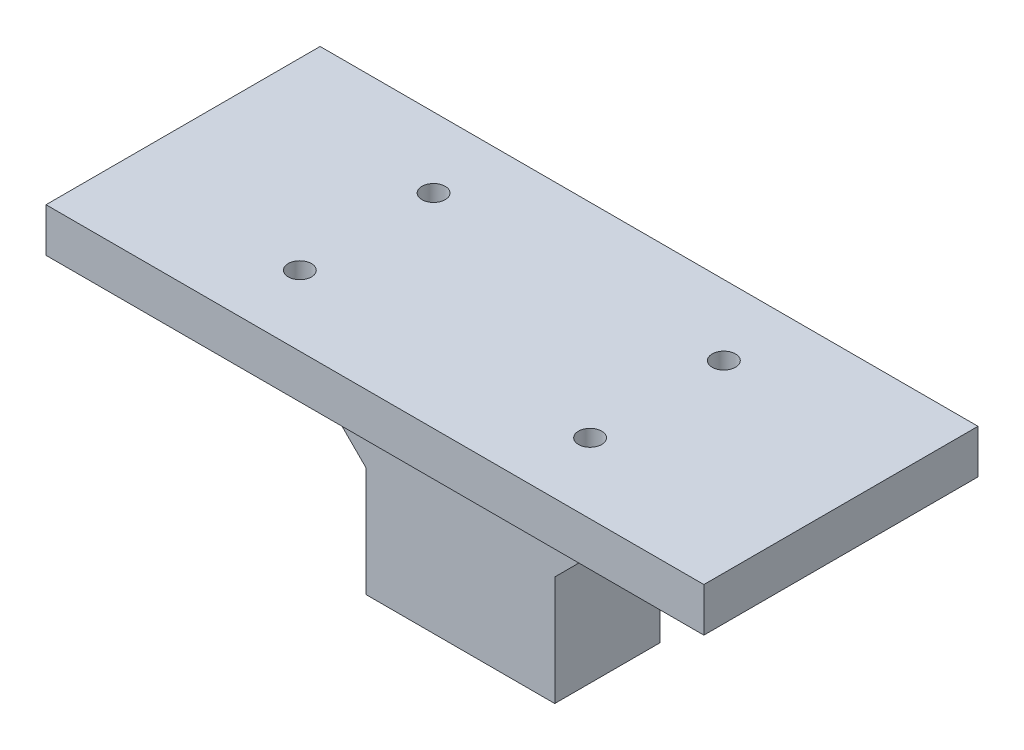
ISO-10303-21;
HEADER;
FILE_DESCRIPTION(('STEP AP214'),'2;1');
FILE_NAME('part.step','',(''),(''),'','','');
FILE_SCHEMA(('AUTOMOTIVE_DESIGN { 1 0 10303 214 1 1 1 1 }'));
ENDSEC;
DATA;
#1=APPLICATION_CONTEXT('core data for automotive mechanical design processes');
#2=APPLICATION_PROTOCOL_DEFINITION('international standard','automotive_design',2000,#1);
#3=PRODUCT_CONTEXT('',#1,'mechanical');
#4=PRODUCT('Part','Part','',(#3));
#5=PRODUCT_RELATED_PRODUCT_CATEGORY('part','',(#4));
#6=PRODUCT_DEFINITION_FORMATION('','',#4);
#7=PRODUCT_DEFINITION_CONTEXT('part definition',#1,'design');
#8=PRODUCT_DEFINITION('design','',#6,#7);
#9=PRODUCT_DEFINITION_SHAPE('','',#8);
#10=(LENGTH_UNIT() NAMED_UNIT(*) SI_UNIT(.MILLI.,.METRE.));
#11=(NAMED_UNIT(*) PLANE_ANGLE_UNIT() SI_UNIT($,.RADIAN.));
#12=(NAMED_UNIT(*) SI_UNIT($,.STERADIAN.) SOLID_ANGLE_UNIT());
#13=UNCERTAINTY_MEASURE_WITH_UNIT(LENGTH_MEASURE(1.E-05),#10,'distance_accuracy_value','');
#14=(GEOMETRIC_REPRESENTATION_CONTEXT(3) GLOBAL_UNCERTAINTY_ASSIGNED_CONTEXT((#13)) GLOBAL_UNIT_ASSIGNED_CONTEXT((#10,
#11,#12)) REPRESENTATION_CONTEXT('',''));
#15=CARTESIAN_POINT('',(0.,0.,0.));
#16=DIRECTION('',(0.,0.,1.));
#17=DIRECTION('',(1.,0.,0.));
#18=AXIS2_PLACEMENT_3D('',#15,#16,#17);
#19=CARTESIAN_POINT('',(125.642135623731,-10.,0.));
#20=DIRECTION('',(0.,0.,1.));
#21=DIRECTION('',(1.,0.,0.));
#22=AXIS2_PLACEMENT_3D('',#19,#20,#21);
#23=CYLINDRICAL_SURFACE('',#22,10.);
#24=CARTESIAN_POINT('',(125.642135623731,-10.,-41.5));
#25=DIRECTION('',(0.,0.,1.));
#26=DIRECTION('',(-1.,0.,0.));
#27=AXIS2_PLACEMENT_3D('',#24,#25,#26);
#28=CIRCLE('',#27,10.);
#29=CARTESIAN_POINT('',(125.642135623731,0.,-41.5));
#30=VERTEX_POINT('',#29);
#31=CARTESIAN_POINT('',(118.571067811865,-2.92893218813453,-41.5));
#32=VERTEX_POINT('',#31);
#33=EDGE_CURVE('E315',#30,#32,#28,.T.);
#34=ORIENTED_EDGE('',*,*,#33,.F.);
#35=DIRECTION('',(0.,0.,-1.));
#36=VECTOR('',#35,1.);
#37=CARTESIAN_POINT('',(125.642135623731,0.,-43.5));
#38=LINE('',#37,#36);
#39=CARTESIAN_POINT('',(125.642135623731,0.,-19.5));
#40=VERTEX_POINT('',#39);
#41=EDGE_CURVE('E248',#40,#30,#38,.T.);
#42=ORIENTED_EDGE('',*,*,#41,.F.);
#43=CARTESIAN_POINT('',(125.642135623731,-10.,-19.5));
#44=DIRECTION('',(0.,0.,-1.));
#45=DIRECTION('',(-1.,0.,0.));
#46=AXIS2_PLACEMENT_3D('',#43,#44,#45);
#47=CIRCLE('',#46,10.);
#48=CARTESIAN_POINT('',(118.571067811865,-2.9289321881345,-19.5));
#49=VERTEX_POINT('',#48);
#50=EDGE_CURVE('E259',#49,#40,#47,.T.);
#51=ORIENTED_EDGE('',*,*,#50,.F.);
#52=DIRECTION('',(0.,0.,-1.));
#53=VECTOR('',#52,1.);
#54=CARTESIAN_POINT('',(118.571067811865,-2.92893218813453,-19.5));
#55=LINE('',#54,#53);
#56=EDGE_CURVE('E250',#32,#49,#55,.F.);
#57=ORIENTED_EDGE('',*,*,#56,.F.);
#58=EDGE_LOOP('',(#34,#42,#51,#57));
#59=FACE_BOUND('',#58,.T.);
#60=ADVANCED_FACE('F46',(#59),#23,.F.);
#61=CARTESIAN_POINT('',(0.,10.,-62.5));
#62=DIRECTION('',(0.,0.,-1.));
#63=DIRECTION('',(-1.,0.,0.));
#64=AXIS2_PLACEMENT_3D('',#61,#62,#63);
#65=PLANE('',#64);
#66=DIRECTION('',(1.,0.,0.));
#67=VECTOR('',#66,1.);
#68=CARTESIAN_POINT('',(0.,0.,-62.5));
#69=LINE('',#68,#67);
#70=CARTESIAN_POINT('',(0.,0.,-62.5));
#71=VERTEX_POINT('',#70);
#72=CARTESIAN_POINT('',(52.5,0.,-62.5));
#73=VERTEX_POINT('',#72);
#74=EDGE_CURVE('E424',#71,#73,#69,.T.);
#75=ORIENTED_EDGE('',*,*,#74,.F.);
#76=DIRECTION('',(0.,-1.,0.));
#77=VECTOR('',#76,1.);
#78=CARTESIAN_POINT('',(0.,10.,-62.5));
#79=LINE('',#78,#77);
#80=CARTESIAN_POINT('',(0.,10.,-62.5));
#81=VERTEX_POINT('',#80);
#82=EDGE_CURVE('E441',#81,#71,#79,.T.);
#83=ORIENTED_EDGE('',*,*,#82,.F.);
#84=DIRECTION('',(1.,0.,0.));
#85=VECTOR('',#84,1.);
#86=CARTESIAN_POINT('',(0.,10.,-62.5));
#87=LINE('',#86,#85);
#88=CARTESIAN_POINT('',(150.,10.,-62.5));
#89=VERTEX_POINT('',#88);
#90=EDGE_CURVE('E400',#81,#89,#87,.T.);
#91=ORIENTED_EDGE('',*,*,#90,.T.);
#92=DIRECTION('',(0.,-1.,0.));
#93=VECTOR('',#92,1.);
#94=CARTESIAN_POINT('',(150.,10.,-62.5));
#95=LINE('',#94,#93);
#96=CARTESIAN_POINT('',(150.,0.,-62.5));
#97=VERTEX_POINT('',#96);
#98=EDGE_CURVE('E411',#89,#97,#95,.T.);
#99=ORIENTED_EDGE('',*,*,#98,.T.);
#100=CARTESIAN_POINT('',(97.5,0.,-62.5));
#101=VERTEX_POINT('',#100);
#102=EDGE_CURVE('E423',#101,#97,#69,.T.);
#103=ORIENTED_EDGE('',*,*,#102,.F.);
#104=DIRECTION('',(-1.,0.,0.));
#105=VECTOR('',#104,1.);
#106=CARTESIAN_POINT('',(96.5,0.,-62.5));
#107=LINE('',#106,#105);
#108=EDGE_CURVE('E76',#101,#73,#107,.T.);
#109=ORIENTED_EDGE('',*,*,#108,.T.);
#110=EDGE_LOOP('',(#75,#83,#91,#99,#103,#109));
#111=FACE_BOUND('',#110,.T.);
#112=ADVANCED_FACE('F493',(#111),#65,.T.);
#113=CARTESIAN_POINT('',(0.,10.,0.));
#114=DIRECTION('',(-1.,0.,0.));
#115=DIRECTION('',(0.,0.,1.));
#116=AXIS2_PLACEMENT_3D('',#113,#114,#115);
#117=PLANE('',#116);
#118=DIRECTION('',(0.,0.,-1.));
#119=VECTOR('',#118,1.);
#120=CARTESIAN_POINT('',(0.,0.,0.));
#121=LINE('',#120,#119);
#122=CARTESIAN_POINT('',(0.,0.,0.));
#123=VERTEX_POINT('',#122);
#124=EDGE_CURVE('E426',#123,#71,#121,.T.);
#125=ORIENTED_EDGE('',*,*,#124,.F.);
#126=DIRECTION('',(0.,-1.,0.));
#127=VECTOR('',#126,1.);
#128=CARTESIAN_POINT('',(0.,10.,0.));
#129=LINE('',#128,#127);
#130=CARTESIAN_POINT('',(0.,10.,0.));
#131=VERTEX_POINT('',#130);
#132=EDGE_CURVE('E439',#131,#123,#129,.T.);
#133=ORIENTED_EDGE('',*,*,#132,.F.);
#134=DIRECTION('',(0.,0.,-1.));
#135=VECTOR('',#134,1.);
#136=CARTESIAN_POINT('',(0.,10.,0.));
#137=LINE('',#136,#135);
#138=EDGE_CURVE('E403',#131,#81,#137,.T.);
#139=ORIENTED_EDGE('',*,*,#138,.T.);
#140=ORIENTED_EDGE('',*,*,#82,.T.);
#141=EDGE_LOOP('',(#125,#133,#139,#140));
#142=FACE_BOUND('',#141,.T.);
#143=ADVANCED_FACE('F503',(#142),#117,.T.);
#144=CARTESIAN_POINT('',(0.,10.,0.));
#145=DIRECTION('',(0.,0.,-1.));
#146=DIRECTION('',(-1.,0.,0.));
#147=AXIS2_PLACEMENT_3D('',#144,#145,#146);
#148=PLANE('',#147);
#149=DIRECTION('',(1.,0.,0.));
#150=VECTOR('',#149,1.);
#151=CARTESIAN_POINT('',(0.,0.,0.));
#152=LINE('',#151,#150);
#153=CARTESIAN_POINT('',(150.,0.,0.));
#154=VERTEX_POINT('',#153);
#155=EDGE_CURVE('E429',#123,#154,#152,.T.);
#156=ORIENTED_EDGE('',*,*,#155,.T.);
#157=DIRECTION('',(0.,-1.,0.));
#158=VECTOR('',#157,1.);
#159=CARTESIAN_POINT('',(150.,10.,0.));
#160=LINE('',#159,#158);
#161=CARTESIAN_POINT('',(150.,10.,0.));
#162=VERTEX_POINT('',#161);
#163=EDGE_CURVE('E436',#162,#154,#160,.T.);
#164=ORIENTED_EDGE('',*,*,#163,.F.);
#165=DIRECTION('',(1.,0.,0.));
#166=VECTOR('',#165,1.);
#167=CARTESIAN_POINT('',(0.,10.,0.));
#168=LINE('',#167,#166);
#169=EDGE_CURVE('E406',#131,#162,#168,.T.);
#170=ORIENTED_EDGE('',*,*,#169,.F.);
#171=ORIENTED_EDGE('',*,*,#132,.T.);
#172=EDGE_LOOP('',(#156,#164,#170,#171));
#173=FACE_BOUND('',#172,.T.);
#174=ADVANCED_FACE('F553',(#173),#148,.F.);
#175=CARTESIAN_POINT('',(108.05464,10.,-46.5));
#176=DIRECTION('',(0.,-1.,0.));
#177=DIRECTION('',(0.,0.,-1.));
#178=AXIS2_PLACEMENT_3D('',#175,#176,#177);
#179=CYLINDRICAL_SURFACE('',#178,2.65);
#180=CARTESIAN_POINT('',(108.05464,10.,-46.5));
#181=DIRECTION('',(0.,1.,0.));
#182=DIRECTION('',(0.,0.,1.));
#183=AXIS2_PLACEMENT_3D('',#180,#181,#182);
#184=CIRCLE('',#183,2.65);
#185=CARTESIAN_POINT('',(108.05464,10.,-43.85));
#186=VERTEX_POINT('',#185);
#187=EDGE_CURVE('E397',#186,#186,#184,.T.);
#188=ORIENTED_EDGE('',*,*,#187,.T.);
#189=EDGE_LOOP('',(#188));
#190=FACE_BOUND('',#189,.T.);
#191=CARTESIAN_POINT('',(108.05464,0.,-46.5));
#192=DIRECTION('',(0.,1.,0.));
#193=DIRECTION('',(0.,0.,1.));
#194=AXIS2_PLACEMENT_3D('',#191,#192,#193);
#195=CIRCLE('',#194,2.65);
#196=CARTESIAN_POINT('',(108.05464,0.,-43.85));
#197=VERTEX_POINT('',#196);
#198=EDGE_CURVE('E420',#197,#197,#195,.T.);
#199=ORIENTED_EDGE('',*,*,#198,.F.);
#200=EDGE_LOOP('',(#199));
#201=FACE_BOUND('',#200,.T.);
#202=ADVANCED_FACE('F550',(#190,#201),#179,.F.);
#203=CARTESIAN_POINT('',(41.87366,10.,-46.5));
#204=DIRECTION('',(0.,-1.,0.));
#205=DIRECTION('',(0.,0.,-1.));
#206=AXIS2_PLACEMENT_3D('',#203,#204,#205);
#207=CYLINDRICAL_SURFACE('',#206,2.65);
#208=CARTESIAN_POINT('',(41.87366,10.,-46.5));
#209=DIRECTION('',(0.,1.,0.));
#210=DIRECTION('',(0.,0.,1.));
#211=AXIS2_PLACEMENT_3D('',#208,#209,#210);
#212=CIRCLE('',#211,2.65);
#213=CARTESIAN_POINT('',(41.87366,10.,-43.85));
#214=VERTEX_POINT('',#213);
#215=EDGE_CURVE('E394',#214,#214,#212,.T.);
#216=ORIENTED_EDGE('',*,*,#215,.T.);
#217=EDGE_LOOP('',(#216));
#218=FACE_BOUND('',#217,.T.);
#219=CARTESIAN_POINT('',(41.87366,0.,-46.5));
#220=DIRECTION('',(0.,1.,0.));
#221=DIRECTION('',(0.,0.,1.));
#222=AXIS2_PLACEMENT_3D('',#219,#220,#221);
#223=CIRCLE('',#222,2.65);
#224=CARTESIAN_POINT('',(41.87366,0.,-43.85));
#225=VERTEX_POINT('',#224);
#226=EDGE_CURVE('E417',#225,#225,#223,.T.);
#227=ORIENTED_EDGE('',*,*,#226,.F.);
#228=EDGE_LOOP('',(#227));
#229=FACE_BOUND('',#228,.T.);
#230=ADVANCED_FACE('F546',(#218,#229),#207,.F.);
#231=CARTESIAN_POINT('',(41.87366,10.,-16.));
#232=DIRECTION('',(0.,-1.,0.));
#233=DIRECTION('',(0.,0.,-1.));
#234=AXIS2_PLACEMENT_3D('',#231,#232,#233);
#235=CYLINDRICAL_SURFACE('',#234,2.65);
#236=CARTESIAN_POINT('',(41.87366,10.,-16.));
#237=DIRECTION('',(0.,1.,0.));
#238=DIRECTION('',(0.,0.,1.));
#239=AXIS2_PLACEMENT_3D('',#236,#237,#238);
#240=CIRCLE('',#239,2.65);
#241=CARTESIAN_POINT('',(41.87366,10.,-13.35));
#242=VERTEX_POINT('',#241);
#243=EDGE_CURVE('E390',#242,#242,#240,.T.);
#244=ORIENTED_EDGE('',*,*,#243,.T.);
#245=EDGE_LOOP('',(#244));
#246=FACE_BOUND('',#245,.T.);
#247=CARTESIAN_POINT('',(41.87366,0.,-16.));
#248=DIRECTION('',(0.,1.,0.));
#249=DIRECTION('',(0.,0.,1.));
#250=AXIS2_PLACEMENT_3D('',#247,#248,#249);
#251=CIRCLE('',#250,2.65);
#252=CARTESIAN_POINT('',(41.87366,0.,-13.35));
#253=VERTEX_POINT('',#252);
#254=EDGE_CURVE('E414',#253,#253,#251,.T.);
#255=ORIENTED_EDGE('',*,*,#254,.F.);
#256=EDGE_LOOP('',(#255));
#257=FACE_BOUND('',#256,.T.);
#258=ADVANCED_FACE('F542',(#246,#257),#235,.F.);
#259=CARTESIAN_POINT('',(108.05464,10.,-16.));
#260=DIRECTION('',(0.,-1.,0.));
#261=DIRECTION('',(0.,0.,-1.));
#262=AXIS2_PLACEMENT_3D('',#259,#260,#261);
#263=CYLINDRICAL_SURFACE('',#262,2.65);
#264=CARTESIAN_POINT('',(108.05464,10.,-16.));
#265=DIRECTION('',(0.,1.,0.));
#266=DIRECTION('',(0.,0.,1.));
#267=AXIS2_PLACEMENT_3D('',#264,#265,#266);
#268=CIRCLE('',#267,2.65);
#269=CARTESIAN_POINT('',(108.05464,10.,-13.35));
#270=VERTEX_POINT('',#269);
#271=EDGE_CURVE('E387',#270,#270,#268,.T.);
#272=ORIENTED_EDGE('',*,*,#271,.T.);
#273=EDGE_LOOP('',(#272));
#274=FACE_BOUND('',#273,.T.);
#275=CARTESIAN_POINT('',(108.05464,0.,-16.));
#276=DIRECTION('',(0.,1.,0.));
#277=DIRECTION('',(0.,0.,1.));
#278=AXIS2_PLACEMENT_3D('',#275,#276,#277);
#279=CIRCLE('',#278,2.65);
#280=CARTESIAN_POINT('',(108.05464,0.,-13.35));
#281=VERTEX_POINT('',#280);
#282=EDGE_CURVE('E386',#281,#281,#279,.T.);
#283=ORIENTED_EDGE('',*,*,#282,.F.);
#284=EDGE_LOOP('',(#283));
#285=FACE_BOUND('',#284,.T.);
#286=ADVANCED_FACE('F539',(#274,#285),#263,.F.);
#287=CARTESIAN_POINT('',(150.,10.,0.));
#288=DIRECTION('',(-1.,0.,0.));
#289=DIRECTION('',(0.,0.,1.));
#290=AXIS2_PLACEMENT_3D('',#287,#288,#289);
#291=PLANE('',#290);
#292=DIRECTION('',(0.,0.,-1.));
#293=VECTOR('',#292,1.);
#294=CARTESIAN_POINT('',(150.,0.,0.));
#295=LINE('',#294,#293);
#296=EDGE_CURVE('E391',#154,#97,#295,.T.);
#297=ORIENTED_EDGE('',*,*,#296,.T.);
#298=ORIENTED_EDGE('',*,*,#98,.F.);
#299=DIRECTION('',(0.,0.,-1.));
#300=VECTOR('',#299,1.);
#301=CARTESIAN_POINT('',(150.,10.,0.));
#302=LINE('',#301,#300);
#303=EDGE_CURVE('E409',#162,#89,#302,.T.);
#304=ORIENTED_EDGE('',*,*,#303,.F.);
#305=ORIENTED_EDGE('',*,*,#163,.T.);
#306=EDGE_LOOP('',(#297,#298,#304,#305));
#307=FACE_BOUND('',#306,.T.);
#308=ADVANCED_FACE('F497',(#307),#291,.F.);
#309=CARTESIAN_POINT('',(0.,10.,0.));
#310=DIRECTION('',(0.,1.,0.));
#311=DIRECTION('',(0.,0.,1.));
#312=AXIS2_PLACEMENT_3D('',#309,#310,#311);
#313=PLANE('',#312);
#314=ORIENTED_EDGE('',*,*,#271,.F.);
#315=EDGE_LOOP('',(#314));
#316=FACE_BOUND('',#315,.T.);
#317=ORIENTED_EDGE('',*,*,#243,.F.);
#318=EDGE_LOOP('',(#317));
#319=FACE_BOUND('',#318,.T.);
#320=ORIENTED_EDGE('',*,*,#215,.F.);
#321=EDGE_LOOP('',(#320));
#322=FACE_BOUND('',#321,.T.);
#323=ORIENTED_EDGE('',*,*,#187,.F.);
#324=EDGE_LOOP('',(#323));
#325=FACE_BOUND('',#324,.T.);
#326=ORIENTED_EDGE('',*,*,#90,.F.);
#327=ORIENTED_EDGE('',*,*,#138,.F.);
#328=ORIENTED_EDGE('',*,*,#169,.T.);
#329=ORIENTED_EDGE('',*,*,#303,.T.);
#330=EDGE_LOOP('',(#326,#327,#328,#329));
#331=FACE_BOUND('',#330,.T.);
#332=ADVANCED_FACE('F562',(#316,#319,#322,#325,#331),#313,.T.);
#333=CARTESIAN_POINT('',(0.,0.,0.));
#334=DIRECTION('',(0.,1.,0.));
#335=DIRECTION('',(0.,0.,1.));
#336=AXIS2_PLACEMENT_3D('',#333,#334,#335);
#337=PLANE('',#336);
#338=DIRECTION('',(0.,0.,-1.));
#339=VECTOR('',#338,1.);
#340=CARTESIAN_POINT('',(97.5,0.,-41.5));
#341=LINE('',#340,#339);
#342=CARTESIAN_POINT('',(97.5,0.,-41.5));
#343=VERTEX_POINT('',#342);
#344=CARTESIAN_POINT('',(97.5,0.,-43.5));
#345=VERTEX_POINT('',#344);
#346=EDGE_CURVE('E316',#343,#345,#341,.T.);
#347=ORIENTED_EDGE('',*,*,#346,.T.);
#348=DIRECTION('',(0.,0.,-1.));
#349=VECTOR('',#348,1.);
#350=CARTESIAN_POINT('',(97.5,0.,0.));
#351=LINE('',#350,#349);
#352=EDGE_CURVE('E267',#345,#101,#351,.T.);
#353=ORIENTED_EDGE('',*,*,#352,.T.);
#354=ORIENTED_EDGE('',*,*,#102,.T.);
#355=ORIENTED_EDGE('',*,*,#296,.F.);
#356=ORIENTED_EDGE('',*,*,#155,.F.);
#357=ORIENTED_EDGE('',*,*,#124,.T.);
#358=ORIENTED_EDGE('',*,*,#74,.T.);
#359=DIRECTION('',(0.,0.,-1.));
#360=VECTOR('',#359,1.);
#361=CARTESIAN_POINT('',(52.5,0.,-43.5));
#362=LINE('',#361,#360);
#363=CARTESIAN_POINT('',(52.5,0.,-43.5));
#364=VERTEX_POINT('',#363);
#365=EDGE_CURVE('E270',#73,#364,#362,.F.);
#366=ORIENTED_EDGE('',*,*,#365,.T.);
#367=DIRECTION('',(0.,0.,-1.));
#368=VECTOR('',#367,1.);
#369=CARTESIAN_POINT('',(52.5,0.,-41.5));
#370=LINE('',#369,#368);
#371=CARTESIAN_POINT('',(52.5,0.,-41.5));
#372=VERTEX_POINT('',#371);
#373=EDGE_CURVE('E228',#372,#364,#370,.T.);
#374=ORIENTED_EDGE('',*,*,#373,.F.);
#375=DIRECTION('',(1.,0.,0.));
#376=VECTOR('',#375,1.);
#377=CARTESIAN_POINT('',(24.3578643762692,0.,-41.5));
#378=LINE('',#377,#376);
#379=CARTESIAN_POINT('',(24.3578643762692,0.,-41.5));
#380=VERTEX_POINT('',#379);
#381=EDGE_CURVE('E220',#380,#372,#378,.T.);
#382=ORIENTED_EDGE('',*,*,#381,.F.);
#383=DIRECTION('',(0.,0.,-1.));
#384=VECTOR('',#383,1.);
#385=CARTESIAN_POINT('',(24.3578643762691,0.,-19.5));
#386=LINE('',#385,#384);
#387=CARTESIAN_POINT('',(24.3578643762691,0.,-19.5));
#388=VERTEX_POINT('',#387);
#389=EDGE_CURVE('E225',#380,#388,#386,.F.);
#390=ORIENTED_EDGE('',*,*,#389,.T.);
#391=DIRECTION('',(-1.,0.,0.));
#392=VECTOR('',#391,1.);
#393=CARTESIAN_POINT('',(0.,0.,-19.5));
#394=LINE('',#393,#392);
#395=EDGE_CURVE('E356',#40,#388,#394,.T.);
#396=ORIENTED_EDGE('',*,*,#395,.F.);
#397=ORIENTED_EDGE('',*,*,#41,.T.);
#398=DIRECTION('',(1.,0.,0.));
#399=VECTOR('',#398,1.);
#400=CARTESIAN_POINT('',(97.5,0.,-41.5));
#401=LINE('',#400,#399);
#402=EDGE_CURVE('E319',#343,#30,#401,.T.);
#403=ORIENTED_EDGE('',*,*,#402,.F.);
#404=EDGE_LOOP('',(#347,#353,#354,#355,#356,#357,#358,#366,#374,#382,#390,#396,#397,#403));
#405=FACE_BOUND('',#404,.T.);
#406=ORIENTED_EDGE('',*,*,#282,.T.);
#407=EDGE_LOOP('',(#406));
#408=FACE_BOUND('',#407,.T.);
#409=ORIENTED_EDGE('',*,*,#254,.T.);
#410=EDGE_LOOP('',(#409));
#411=FACE_BOUND('',#410,.T.);
#412=ORIENTED_EDGE('',*,*,#226,.T.);
#413=EDGE_LOOP('',(#412));
#414=FACE_BOUND('',#413,.T.);
#415=ORIENTED_EDGE('',*,*,#198,.T.);
#416=EDGE_LOOP('',(#415));
#417=FACE_BOUND('',#416,.T.);
#418=ADVANCED_FACE('F222',(#405,#408,#411,#414,#417),#337,.F.);
#419=CARTESIAN_POINT('',(96.5,-50.,0.));
#420=DIRECTION('',(1.,0.,0.));
#421=DIRECTION('',(0.,0.,-1.));
#422=AXIS2_PLACEMENT_3D('',#419,#420,#421);
#423=PLANE('',#422);
#424=DIRECTION('',(0.,1.,0.));
#425=VECTOR('',#424,1.);
#426=CARTESIAN_POINT('',(96.5,-50.,-43.5));
#427=LINE('',#426,#425);
#428=CARTESIAN_POINT('',(96.5,-50.,-43.5));
#429=VERTEX_POINT('',#428);
#430=CARTESIAN_POINT('',(96.5,-25.,-43.5));
#431=VERTEX_POINT('',#430);
#432=EDGE_CURVE('E373',#429,#431,#427,.T.);
#433=ORIENTED_EDGE('',*,*,#432,.T.);
#434=DIRECTION('',(0.,0.,1.));
#435=VECTOR('',#434,1.);
#436=CARTESIAN_POINT('',(96.5,-24.9999999999999,0.));
#437=LINE('',#436,#435);
#438=CARTESIAN_POINT('',(96.5,-24.9999999999999,-19.5));
#439=VERTEX_POINT('',#438);
#440=EDGE_CURVE('E443',#431,#439,#437,.T.);
#441=ORIENTED_EDGE('',*,*,#440,.T.);
#442=DIRECTION('',(0.,1.,0.));
#443=VECTOR('',#442,1.);
#444=CARTESIAN_POINT('',(96.5,-50.,-19.5));
#445=LINE('',#444,#443);
#446=CARTESIAN_POINT('',(96.5,-50.,-19.5));
#447=VERTEX_POINT('',#446);
#448=EDGE_CURVE('E383',#447,#439,#445,.T.);
#449=ORIENTED_EDGE('',*,*,#448,.F.);
#450=DIRECTION('',(0.,0.,-1.));
#451=VECTOR('',#450,1.);
#452=CARTESIAN_POINT('',(96.5,-50.,0.));
#453=LINE('',#452,#451);
#454=EDGE_CURVE('E363',#447,#429,#453,.T.);
#455=ORIENTED_EDGE('',*,*,#454,.T.);
#456=EDGE_LOOP('',(#433,#441,#449,#455));
#457=FACE_BOUND('',#456,.T.);
#458=ADVANCED_FACE('F470',(#457),#423,.T.);
#459=CARTESIAN_POINT('',(0.,-50.,-19.5));
#460=DIRECTION('',(0.,0.,-1.));
#461=DIRECTION('',(-1.,0.,0.));
#462=AXIS2_PLACEMENT_3D('',#459,#460,#461);
#463=PLANE('',#462);
#464=ORIENTED_EDGE('',*,*,#395,.T.);
#465=CARTESIAN_POINT('',(24.3578643762691,-10.,-19.5));
#466=DIRECTION('',(0.,0.,-1.));
#467=DIRECTION('',(-1.,0.,0.));
#468=AXIS2_PLACEMENT_3D('',#465,#466,#467);
#469=CIRCLE('',#468,10.);
#470=CARTESIAN_POINT('',(31.4289321881346,-2.92893218813452,-19.5));
#471=VERTEX_POINT('',#470);
#472=EDGE_CURVE('E246',#388,#471,#469,.T.);
#473=ORIENTED_EDGE('',*,*,#472,.T.);
#474=DIRECTION('',(-0.707106781186548,0.707106781186547,0.));
#475=VECTOR('',#474,1.);
#476=CARTESIAN_POINT('',(39.25,-10.7499999999999,-19.5));
#477=LINE('',#476,#475);
#478=CARTESIAN_POINT('',(53.5,-24.9999999999999,-19.5));
#479=VERTEX_POINT('',#478);
#480=EDGE_CURVE('E253',#471,#479,#477,.F.);
#481=ORIENTED_EDGE('',*,*,#480,.T.);
#482=DIRECTION('',(0.,1.,0.));
#483=VECTOR('',#482,1.);
#484=CARTESIAN_POINT('',(53.5,-50.,-19.5));
#485=LINE('',#484,#483);
#486=CARTESIAN_POINT('',(53.5,-50.,-19.5));
#487=VERTEX_POINT('',#486);
#488=EDGE_CURVE('E380',#487,#479,#485,.T.);
#489=ORIENTED_EDGE('',*,*,#488,.F.);
#490=DIRECTION('',(-1.,0.,0.));
#491=VECTOR('',#490,1.);
#492=CARTESIAN_POINT('',(0.,-50.,-19.5));
#493=LINE('',#492,#491);
#494=EDGE_CURVE('E366',#447,#487,#493,.T.);
#495=ORIENTED_EDGE('',*,*,#494,.F.);
#496=ORIENTED_EDGE('',*,*,#448,.T.);
#497=DIRECTION('',(0.707106781186548,0.707106781186548,0.));
#498=VECTOR('',#497,1.);
#499=CARTESIAN_POINT('',(35.75,-85.75,-19.5));
#500=LINE('',#499,#498);
#501=EDGE_CURVE('E448',#439,#49,#500,.T.);
#502=ORIENTED_EDGE('',*,*,#501,.T.);
#503=ORIENTED_EDGE('',*,*,#50,.T.);
#504=EDGE_LOOP('',(#464,#473,#481,#489,#495,#496,#502,#503));
#505=FACE_BOUND('',#504,.T.);
#506=ADVANCED_FACE('F453',(#505),#463,.F.);
#507=CARTESIAN_POINT('',(53.5,-50.,0.));
#508=DIRECTION('',(1.,0.,0.));
#509=DIRECTION('',(0.,0.,-1.));
#510=AXIS2_PLACEMENT_3D('',#507,#508,#509);
#511=PLANE('',#510);
#512=ORIENTED_EDGE('',*,*,#488,.T.);
#513=DIRECTION('',(0.,0.,-1.));
#514=VECTOR('',#513,1.);
#515=CARTESIAN_POINT('',(53.5,-24.9999999999999,-43.5));
#516=LINE('',#515,#514);
#517=CARTESIAN_POINT('',(53.5,-24.9999999999999,-43.5));
#518=VERTEX_POINT('',#517);
#519=EDGE_CURVE('E445',#479,#518,#516,.T.);
#520=ORIENTED_EDGE('',*,*,#519,.T.);
#521=DIRECTION('',(0.,1.,0.));
#522=VECTOR('',#521,1.);
#523=CARTESIAN_POINT('',(53.5,-50.,-43.5));
#524=LINE('',#523,#522);
#525=CARTESIAN_POINT('',(53.5,-50.,-43.5));
#526=VERTEX_POINT('',#525);
#527=EDGE_CURVE('E377',#526,#518,#524,.T.);
#528=ORIENTED_EDGE('',*,*,#527,.F.);
#529=DIRECTION('',(0.,0.,-1.));
#530=VECTOR('',#529,1.);
#531=CARTESIAN_POINT('',(53.5,-50.,0.));
#532=LINE('',#531,#530);
#533=EDGE_CURVE('E368',#487,#526,#532,.T.);
#534=ORIENTED_EDGE('',*,*,#533,.F.);
#535=EDGE_LOOP('',(#512,#520,#528,#534));
#536=FACE_BOUND('',#535,.T.);
#537=ADVANCED_FACE('F458',(#536),#511,.F.);
#538=CARTESIAN_POINT('',(0.,-50.,-43.5));
#539=DIRECTION('',(0.,0.,-1.));
#540=DIRECTION('',(-1.,0.,0.));
#541=AXIS2_PLACEMENT_3D('',#538,#539,#540);
#542=PLANE('',#541);
#543=DIRECTION('',(-1.,0.,0.));
#544=VECTOR('',#543,1.);
#545=CARTESIAN_POINT('',(96.5,-25.,-43.5));
#546=LINE('',#545,#544);
#547=EDGE_CURVE('E328',#431,#518,#546,.T.);
#548=ORIENTED_EDGE('',*,*,#547,.F.);
#549=ORIENTED_EDGE('',*,*,#432,.F.);
#550=DIRECTION('',(-1.,0.,0.));
#551=VECTOR('',#550,1.);
#552=CARTESIAN_POINT('',(0.,-50.,-43.5));
#553=LINE('',#552,#551);
#554=EDGE_CURVE('E370',#429,#526,#553,.T.);
#555=ORIENTED_EDGE('',*,*,#554,.T.);
#556=ORIENTED_EDGE('',*,*,#527,.T.);
#557=EDGE_LOOP('',(#548,#549,#555,#556));
#558=FACE_BOUND('',#557,.T.);
#559=ADVANCED_FACE('F467',(#558),#542,.T.);
#560=CARTESIAN_POINT('',(0.,-50.,0.));
#561=DIRECTION('',(0.,-1.,0.));
#562=DIRECTION('',(0.,0.,-1.));
#563=AXIS2_PLACEMENT_3D('',#560,#561,#562);
#564=PLANE('',#563);
#565=DIRECTION('',(1.,0.,0.));
#566=VECTOR('',#565,1.);
#567=CARTESIAN_POINT('',(54.95366,-50.,-42.));
#568=LINE('',#567,#566);
#569=CARTESIAN_POINT('',(54.95366,-50.,-42.));
#570=VERTEX_POINT('',#569);
#571=CARTESIAN_POINT('',(95.05366,-50.,-42.));
#572=VERTEX_POINT('',#571);
#573=EDGE_CURVE('E331',#570,#572,#568,.T.);
#574=ORIENTED_EDGE('',*,*,#573,.F.);
#575=DIRECTION('',(0.,0.,-1.));
#576=VECTOR('',#575,1.);
#577=CARTESIAN_POINT('',(54.95366,-50.,-21.));
#578=LINE('',#577,#576);
#579=CARTESIAN_POINT('',(54.95366,-50.,-21.));
#580=VERTEX_POINT('',#579);
#581=EDGE_CURVE('E337',#580,#570,#578,.T.);
#582=ORIENTED_EDGE('',*,*,#581,.F.);
#583=DIRECTION('',(1.,0.,0.));
#584=VECTOR('',#583,1.);
#585=CARTESIAN_POINT('',(54.95366,-50.,-21.));
#586=LINE('',#585,#584);
#587=CARTESIAN_POINT('',(95.05366,-50.,-21.));
#588=VERTEX_POINT('',#587);
#589=EDGE_CURVE('E349',#580,#588,#586,.T.);
#590=ORIENTED_EDGE('',*,*,#589,.T.);
#591=DIRECTION('',(0.,0.,-1.));
#592=VECTOR('',#591,1.);
#593=CARTESIAN_POINT('',(95.05366,-50.,-21.));
#594=LINE('',#593,#592);
#595=EDGE_CURVE('E346',#588,#572,#594,.T.);
#596=ORIENTED_EDGE('',*,*,#595,.T.);
#597=EDGE_LOOP('',(#574,#582,#590,#596));
#598=FACE_BOUND('',#597,.T.);
#599=ORIENTED_EDGE('',*,*,#454,.F.);
#600=ORIENTED_EDGE('',*,*,#494,.T.);
#601=ORIENTED_EDGE('',*,*,#533,.T.);
#602=ORIENTED_EDGE('',*,*,#554,.F.);
#603=EDGE_LOOP('',(#599,#600,#601,#602));
#604=FACE_BOUND('',#603,.T.);
#605=ADVANCED_FACE('F538',(#598,#604),#564,.T.);
#606=CARTESIAN_POINT('',(121.5,0.,0.));
#607=DIRECTION('',(-0.707106781186548,0.707106781186548,0.));
#608=DIRECTION('',(0.,0.,-1.));
#609=AXIS2_PLACEMENT_3D('',#606,#607,#608);
#610=PLANE('',#609);
#611=CARTESIAN_POINT('',(97.5,-23.9999999999999,-44.5));
#612=DIRECTION('',(-0.707106781186548,0.707106781186548,0.));
#613=DIRECTION('',(-0.707106781186548,-0.707106781186548,0.));
#614=AXIS2_PLACEMENT_3D('',#611,#612,#613);
#615=ELLIPSE('',#614,1.41421356237309,1.);
#616=CARTESIAN_POINT('',(96.8341260138224,-24.6658739861776,-43.7539357705051));
#617=VERTEX_POINT('',#616);
#618=CARTESIAN_POINT('',(97.5,-23.9999999999999,-43.5));
#619=VERTEX_POINT('',#618);
#620=EDGE_CURVE('E287',#617,#619,#615,.T.);
#621=ORIENTED_EDGE('',*,*,#620,.T.);
#622=DIRECTION('',(0.,0.,-1.));
#623=VECTOR('',#622,1.);
#624=CARTESIAN_POINT('',(97.5,-23.9999999999999,-41.5));
#625=LINE('',#624,#623);
#626=CARTESIAN_POINT('',(97.5,-23.9999999999999,-41.5));
#627=VERTEX_POINT('',#626);
#628=EDGE_CURVE('E84',#627,#619,#625,.T.);
#629=ORIENTED_EDGE('',*,*,#628,.F.);
#630=DIRECTION('',(-0.707106781186548,-0.707106781186548,0.));
#631=VECTOR('',#630,1.);
#632=CARTESIAN_POINT('',(97.5,-23.9999999999999,-41.5));
#633=LINE('',#632,#631);
#634=EDGE_CURVE('E242',#32,#627,#633,.T.);
#635=ORIENTED_EDGE('',*,*,#634,.F.);
#636=ORIENTED_EDGE('',*,*,#56,.T.);
#637=ORIENTED_EDGE('',*,*,#501,.F.);
#638=ORIENTED_EDGE('',*,*,#440,.F.);
#639=DIRECTION('',(0.62286257729328,0.62286257729328,-0.473375558742892));
#640=VECTOR('',#639,1.);
#641=CARTESIAN_POINT('',(96.4999999999999,-25.,-43.5));
#642=LINE('',#641,#640);
#643=EDGE_CURVE('E56',#431,#617,#642,.T.);
#644=ORIENTED_EDGE('',*,*,#643,.T.);
#645=EDGE_LOOP('',(#621,#629,#635,#636,#637,#638,#644));
#646=FACE_BOUND('',#645,.T.);
#647=ADVANCED_FACE('F475',(#646),#610,.F.);
#648=CARTESIAN_POINT('',(53.5,-24.9999999999999,0.));
#649=DIRECTION('',(-0.707106781186547,-0.707106781186548,0.));
#650=DIRECTION('',(0.,0.,1.));
#651=AXIS2_PLACEMENT_3D('',#648,#649,#650);
#652=PLANE('',#651);
#653=DIRECTION('',(-0.707106781186548,0.707106781186547,0.));
#654=VECTOR('',#653,1.);
#655=CARTESIAN_POINT('',(52.5,-23.9999999999999,-41.5));
#656=LINE('',#655,#654);
#657=CARTESIAN_POINT('',(52.5,-23.9999999999999,-41.5));
#658=VERTEX_POINT('',#657);
#659=CARTESIAN_POINT('',(31.4289321881346,-2.92893218813453,-41.5));
#660=VERTEX_POINT('',#659);
#661=EDGE_CURVE('E238',#658,#660,#656,.T.);
#662=ORIENTED_EDGE('',*,*,#661,.F.);
#663=DIRECTION('',(0.,0.,-1.));
#664=VECTOR('',#663,1.);
#665=CARTESIAN_POINT('',(52.5,-23.9999999999999,-41.5));
#666=LINE('',#665,#664);
#667=CARTESIAN_POINT('',(52.5,-23.9999999999999,-43.5));
#668=VERTEX_POINT('',#667);
#669=EDGE_CURVE('E304',#658,#668,#666,.T.);
#670=ORIENTED_EDGE('',*,*,#669,.T.);
#671=CARTESIAN_POINT('',(52.5,-23.9999999999999,-44.5));
#672=DIRECTION('',(-0.707106781186547,-0.707106781186548,0.));
#673=DIRECTION('',(-0.707106781186548,0.707106781186547,0.));
#674=AXIS2_PLACEMENT_3D('',#671,#672,#673);
#675=ELLIPSE('',#674,1.41421356237309,1.);
#676=CARTESIAN_POINT('',(53.1658739861777,-24.6658739861776,-43.7539357705051));
#677=VERTEX_POINT('',#676);
#678=EDGE_CURVE('E65',#668,#677,#675,.F.);
#679=ORIENTED_EDGE('',*,*,#678,.T.);
#680=DIRECTION('',(0.62286257729328,-0.62286257729328,0.473375558742892));
#681=VECTOR('',#680,1.);
#682=CARTESIAN_POINT('',(66.3258845437617,-37.8258845437616,-33.7523277467412));
#683=LINE('',#682,#681);
#684=EDGE_CURVE('E11',#518,#677,#683,.F.);
#685=ORIENTED_EDGE('',*,*,#684,.F.);
#686=ORIENTED_EDGE('',*,*,#519,.F.);
#687=ORIENTED_EDGE('',*,*,#480,.F.);
#688=DIRECTION('',(0.,0.,1.));
#689=VECTOR('',#688,1.);
#690=CARTESIAN_POINT('',(31.4289321881346,-2.92893218813453,-43.5));
#691=LINE('',#690,#689);
#692=EDGE_CURVE('E247',#471,#660,#691,.F.);
#693=ORIENTED_EDGE('',*,*,#692,.T.);
#694=EDGE_LOOP('',(#662,#670,#679,#685,#686,#687,#693));
#695=FACE_BOUND('',#694,.T.);
#696=ADVANCED_FACE('F460',(#695),#652,.T.);
#697=CARTESIAN_POINT('',(54.95366,-10.,-42.));
#698=DIRECTION('',(0.,0.,-1.));
#699=DIRECTION('',(-1.,0.,0.));
#700=AXIS2_PLACEMENT_3D('',#697,#698,#699);
#701=PLANE('',#700);
#702=ORIENTED_EDGE('',*,*,#573,.T.);
#703=DIRECTION('',(0.,-1.,0.));
#704=VECTOR('',#703,1.);
#705=CARTESIAN_POINT('',(95.05366,-10.,-42.));
#706=LINE('',#705,#704);
#707=CARTESIAN_POINT('',(95.05366,-10.,-42.));
#708=VERTEX_POINT('',#707);
#709=EDGE_CURVE('E344',#708,#572,#706,.T.);
#710=ORIENTED_EDGE('',*,*,#709,.F.);
#711=DIRECTION('',(1.,0.,0.));
#712=VECTOR('',#711,1.);
#713=CARTESIAN_POINT('',(54.95366,-10.,-42.));
#714=LINE('',#713,#712);
#715=CARTESIAN_POINT('',(54.95366,-10.,-42.));
#716=VERTEX_POINT('',#715);
#717=EDGE_CURVE('E333',#716,#708,#714,.T.);
#718=ORIENTED_EDGE('',*,*,#717,.F.);
#719=DIRECTION('',(0.,-1.,0.));
#720=VECTOR('',#719,1.);
#721=CARTESIAN_POINT('',(54.95366,-10.,-42.));
#722=LINE('',#721,#720);
#723=EDGE_CURVE('E354',#716,#570,#722,.T.);
#724=ORIENTED_EDGE('',*,*,#723,.T.);
#725=EDGE_LOOP('',(#702,#710,#718,#724));
#726=FACE_BOUND('',#725,.T.);
#727=ADVANCED_FACE('F533',(#726),#701,.F.);
#728=CARTESIAN_POINT('',(54.95366,-10.,-21.));
#729=DIRECTION('',(-1.,0.,0.));
#730=DIRECTION('',(0.,0.,1.));
#731=AXIS2_PLACEMENT_3D('',#728,#729,#730);
#732=PLANE('',#731);
#733=ORIENTED_EDGE('',*,*,#581,.T.);
#734=ORIENTED_EDGE('',*,*,#723,.F.);
#735=DIRECTION('',(0.,0.,-1.));
#736=VECTOR('',#735,1.);
#737=CARTESIAN_POINT('',(54.95366,-10.,-21.));
#738=LINE('',#737,#736);
#739=CARTESIAN_POINT('',(54.95366,-10.,-21.));
#740=VERTEX_POINT('',#739);
#741=EDGE_CURVE('E341',#740,#716,#738,.T.);
#742=ORIENTED_EDGE('',*,*,#741,.F.);
#743=DIRECTION('',(0.,-1.,0.));
#744=VECTOR('',#743,1.);
#745=CARTESIAN_POINT('',(54.95366,-10.,-21.));
#746=LINE('',#745,#744);
#747=EDGE_CURVE('E357',#740,#580,#746,.T.);
#748=ORIENTED_EDGE('',*,*,#747,.T.);
#749=EDGE_LOOP('',(#733,#734,#742,#748));
#750=FACE_BOUND('',#749,.T.);
#751=ADVANCED_FACE('F581',(#750),#732,.F.);
#752=CARTESIAN_POINT('',(54.95366,-10.,-21.));
#753=DIRECTION('',(0.,0.,-1.));
#754=DIRECTION('',(-1.,0.,0.));
#755=AXIS2_PLACEMENT_3D('',#752,#753,#754);
#756=PLANE('',#755);
#757=ORIENTED_EDGE('',*,*,#589,.F.);
#758=ORIENTED_EDGE('',*,*,#747,.F.);
#759=DIRECTION('',(1.,0.,0.));
#760=VECTOR('',#759,1.);
#761=CARTESIAN_POINT('',(54.95366,-10.,-21.));
#762=LINE('',#761,#760);
#763=CARTESIAN_POINT('',(95.05366,-10.,-21.));
#764=VERTEX_POINT('',#763);
#765=EDGE_CURVE('E339',#740,#764,#762,.T.);
#766=ORIENTED_EDGE('',*,*,#765,.T.);
#767=DIRECTION('',(0.,-1.,0.));
#768=VECTOR('',#767,1.);
#769=CARTESIAN_POINT('',(95.05366,-10.,-21.));
#770=LINE('',#769,#768);
#771=EDGE_CURVE('E359',#764,#588,#770,.T.);
#772=ORIENTED_EDGE('',*,*,#771,.T.);
#773=EDGE_LOOP('',(#757,#758,#766,#772));
#774=FACE_BOUND('',#773,.T.);
#775=ADVANCED_FACE('F587',(#774),#756,.T.);
#776=CARTESIAN_POINT('',(95.05366,-10.,-21.));
#777=DIRECTION('',(-1.,0.,0.));
#778=DIRECTION('',(0.,0.,1.));
#779=AXIS2_PLACEMENT_3D('',#776,#777,#778);
#780=PLANE('',#779);
#781=ORIENTED_EDGE('',*,*,#595,.F.);
#782=ORIENTED_EDGE('',*,*,#771,.F.);
#783=DIRECTION('',(0.,0.,-1.));
#784=VECTOR('',#783,1.);
#785=CARTESIAN_POINT('',(95.05366,-10.,-21.));
#786=LINE('',#785,#784);
#787=EDGE_CURVE('E336',#764,#708,#786,.T.);
#788=ORIENTED_EDGE('',*,*,#787,.T.);
#789=ORIENTED_EDGE('',*,*,#709,.T.);
#790=EDGE_LOOP('',(#781,#782,#788,#789));
#791=FACE_BOUND('',#790,.T.);
#792=ADVANCED_FACE('F583',(#791),#780,.T.);
#793=CARTESIAN_POINT('',(0.,-10.,0.));
#794=DIRECTION('',(0.,1.,0.));
#795=DIRECTION('',(0.,0.,1.));
#796=AXIS2_PLACEMENT_3D('',#793,#794,#795);
#797=PLANE('',#796);
#798=ORIENTED_EDGE('',*,*,#717,.T.);
#799=ORIENTED_EDGE('',*,*,#787,.F.);
#800=ORIENTED_EDGE('',*,*,#765,.F.);
#801=ORIENTED_EDGE('',*,*,#741,.T.);
#802=EDGE_LOOP('',(#798,#799,#800,#801));
#803=FACE_BOUND('',#802,.T.);
#804=ADVANCED_FACE('F586',(#803),#797,.F.);
#805=CARTESIAN_POINT('',(96.5,-25.,-43.5));
#806=DIRECTION('',(0.,-0.605083267533557,-0.796162194123103));
#807=DIRECTION('',(0.,0.796162194123103,-0.605083267533557));
#808=AXIS2_PLACEMENT_3D('',#805,#806,#807);
#809=PLANE('',#808);
#810=DIRECTION('',(0.,-0.796162194123103,0.605083267533557));
#811=VECTOR('',#810,1.);
#812=CARTESIAN_POINT('',(53.5,-25.,-43.5));
#813=LINE('',#812,#811);
#814=CARTESIAN_POINT('',(53.5,-1.,-61.74));
#815=VERTEX_POINT('',#814);
#816=CARTESIAN_POINT('',(53.5,-23.6842105263158,-44.5));
#817=VERTEX_POINT('',#816);
#818=EDGE_CURVE('E295',#815,#817,#813,.T.);
#819=ORIENTED_EDGE('',*,*,#818,.F.);
#820=CARTESIAN_POINT('',(52.5,-1.,-61.74));
#821=DIRECTION('',(0.,-0.605083267533557,-0.796162194123103));
#822=DIRECTION('',(0.,-0.796162194123103,0.605083267533557));
#823=AXIS2_PLACEMENT_3D('',#820,#821,#822);
#824=ELLIPSE('',#823,1.25602547744861,1.);
#825=EDGE_CURVE('E280',#815,#73,#824,.F.);
#826=ORIENTED_EDGE('',*,*,#825,.T.);
#827=ORIENTED_EDGE('',*,*,#108,.F.);
#828=CARTESIAN_POINT('',(97.5,-1.,-61.74));
#829=DIRECTION('',(0.,-0.605083267533557,-0.796162194123103));
#830=DIRECTION('',(0.,0.796162194123103,-0.605083267533557));
#831=AXIS2_PLACEMENT_3D('',#828,#829,#830);
#832=ELLIPSE('',#831,1.25602547744861,1.);
#833=CARTESIAN_POINT('',(96.5,-1.,-61.74));
#834=VERTEX_POINT('',#833);
#835=EDGE_CURVE('E283',#101,#834,#832,.F.);
#836=ORIENTED_EDGE('',*,*,#835,.T.);
#837=DIRECTION('',(0.,-0.796162194123103,0.605083267533557));
#838=VECTOR('',#837,1.);
#839=CARTESIAN_POINT('',(96.5,-25.,-43.5));
#840=LINE('',#839,#838);
#841=CARTESIAN_POINT('',(96.5,-23.6842105263158,-44.5));
#842=VERTEX_POINT('',#841);
#843=EDGE_CURVE('E301',#834,#842,#840,.T.);
#844=ORIENTED_EDGE('',*,*,#843,.T.);
#845=CARTESIAN_POINT('',(97.5,-23.6842105263158,-44.5));
#846=DIRECTION('',(0.,-0.605083267533557,-0.796162194123103));
#847=DIRECTION('',(0.,-0.796162194123103,0.605083267533557));
#848=AXIS2_PLACEMENT_3D('',#845,#846,#847);
#849=ELLIPSE('',#848,1.65266510190606,1.);
#850=EDGE_CURVE('E285',#842,#617,#849,.F.);
#851=ORIENTED_EDGE('',*,*,#850,.T.);
#852=ORIENTED_EDGE('',*,*,#643,.F.);
#853=ORIENTED_EDGE('',*,*,#547,.T.);
#854=ORIENTED_EDGE('',*,*,#684,.T.);
#855=CARTESIAN_POINT('',(52.5,-23.6842105263158,-44.5));
#856=DIRECTION('',(0.,-0.605083267533557,-0.796162194123103));
#857=DIRECTION('',(0.,0.796162194123103,-0.605083267533557));
#858=AXIS2_PLACEMENT_3D('',#855,#856,#857);
#859=ELLIPSE('',#858,1.65266510190606,1.);
#860=EDGE_CURVE('E290',#677,#817,#859,.F.);
#861=ORIENTED_EDGE('',*,*,#860,.T.);
#862=EDGE_LOOP('',(#819,#826,#827,#836,#844,#851,#852,#853,#854,#861));
#863=FACE_BOUND('',#862,.T.);
#864=ADVANCED_FACE('F465',(#863),#809,.T.);
#865=CARTESIAN_POINT('',(96.5,0.,0.));
#866=DIRECTION('',(1.,0.,0.));
#867=DIRECTION('',(0.,0.,-1.));
#868=AXIS2_PLACEMENT_3D('',#865,#866,#867);
#869=PLANE('',#868);
#870=ORIENTED_EDGE('',*,*,#843,.F.);
#871=DIRECTION('',(0.,0.,-1.));
#872=VECTOR('',#871,1.);
#873=CARTESIAN_POINT('',(96.5,-1.,0.));
#874=LINE('',#873,#872);
#875=CARTESIAN_POINT('',(96.5,-1.,-44.5));
#876=VERTEX_POINT('',#875);
#877=EDGE_CURVE('E274',#834,#876,#874,.F.);
#878=ORIENTED_EDGE('',*,*,#877,.T.);
#879=DIRECTION('',(0.,1.,0.));
#880=VECTOR('',#879,1.);
#881=CARTESIAN_POINT('',(96.5,-25.,-44.5));
#882=LINE('',#881,#880);
#883=EDGE_CURVE('E272',#876,#842,#882,.F.);
#884=ORIENTED_EDGE('',*,*,#883,.T.);
#885=EDGE_LOOP('',(#870,#878,#884));
#886=FACE_BOUND('',#885,.T.);
#887=ADVANCED_FACE('F600',(#886),#869,.T.);
#888=CARTESIAN_POINT('',(53.5,0.,0.));
#889=DIRECTION('',(1.,0.,0.));
#890=DIRECTION('',(0.,0.,-1.));
#891=AXIS2_PLACEMENT_3D('',#888,#889,#890);
#892=PLANE('',#891);
#893=DIRECTION('',(0.,1.,0.));
#894=VECTOR('',#893,1.);
#895=CARTESIAN_POINT('',(53.5,0.,-44.5));
#896=LINE('',#895,#894);
#897=CARTESIAN_POINT('',(53.5,-1.,-44.5));
#898=VERTEX_POINT('',#897);
#899=EDGE_CURVE('E262',#817,#898,#896,.T.);
#900=ORIENTED_EDGE('',*,*,#899,.T.);
#901=DIRECTION('',(0.,0.,-1.));
#902=VECTOR('',#901,1.);
#903=CARTESIAN_POINT('',(53.5,-1.,-62.5));
#904=LINE('',#903,#902);
#905=EDGE_CURVE('E264',#898,#815,#904,.T.);
#906=ORIENTED_EDGE('',*,*,#905,.T.);
#907=ORIENTED_EDGE('',*,*,#818,.T.);
#908=EDGE_LOOP('',(#900,#906,#907));
#909=FACE_BOUND('',#908,.T.);
#910=ADVANCED_FACE('F526',(#909),#892,.F.);
#911=CARTESIAN_POINT('',(24.3578643762691,-10.,0.));
#912=DIRECTION('',(0.,0.,1.));
#913=DIRECTION('',(1.,0.,0.));
#914=AXIS2_PLACEMENT_3D('',#911,#912,#913);
#915=CYLINDRICAL_SURFACE('',#914,10.);
#916=ORIENTED_EDGE('',*,*,#389,.F.);
#917=CARTESIAN_POINT('',(24.3578643762691,-10.,-41.5));
#918=DIRECTION('',(0.,0.,1.));
#919=DIRECTION('',(1.,0.,0.));
#920=AXIS2_PLACEMENT_3D('',#917,#918,#919);
#921=CIRCLE('',#920,10.);
#922=EDGE_CURVE('E233',#660,#380,#921,.T.);
#923=ORIENTED_EDGE('',*,*,#922,.F.);
#924=ORIENTED_EDGE('',*,*,#692,.F.);
#925=ORIENTED_EDGE('',*,*,#472,.F.);
#926=EDGE_LOOP('',(#916,#923,#924,#925));
#927=FACE_BOUND('',#926,.T.);
#928=ADVANCED_FACE('F245',(#927),#915,.F.);
#929=CARTESIAN_POINT('',(52.5,0.,-44.5));
#930=DIRECTION('',(0.,1.,0.));
#931=DIRECTION('',(0.,0.,1.));
#932=AXIS2_PLACEMENT_3D('',#929,#930,#931);
#933=CYLINDRICAL_SURFACE('',#932,1.);
#934=ORIENTED_EDGE('',*,*,#678,.F.);
#935=DIRECTION('',(0.,1.,0.));
#936=VECTOR('',#935,1.);
#937=CARTESIAN_POINT('',(52.5,-50.,-43.5));
#938=LINE('',#937,#936);
#939=EDGE_CURVE('E278',#364,#668,#938,.F.);
#940=ORIENTED_EDGE('',*,*,#939,.F.);
#941=CARTESIAN_POINT('',(52.5,-1.,-44.5));
#942=DIRECTION('',(0.,-0.707106781186547,0.707106781186547));
#943=DIRECTION('',(0.,0.707106781186547,0.707106781186547));
#944=AXIS2_PLACEMENT_3D('',#941,#942,#943);
#945=ELLIPSE('',#944,1.41421356237309,1.);
#946=EDGE_CURVE('E293',#898,#364,#945,.T.);
#947=ORIENTED_EDGE('',*,*,#946,.F.);
#948=ORIENTED_EDGE('',*,*,#899,.F.);
#949=ORIENTED_EDGE('',*,*,#860,.F.);
#950=EDGE_LOOP('',(#934,#940,#947,#948,#949));
#951=FACE_BOUND('',#950,.T.);
#952=ADVANCED_FACE('F509',(#951),#933,.F.);
#953=CARTESIAN_POINT('',(52.5,-1.,0.));
#954=DIRECTION('',(0.,0.,1.));
#955=DIRECTION('',(1.,0.,0.));
#956=AXIS2_PLACEMENT_3D('',#953,#954,#955);
#957=CYLINDRICAL_SURFACE('',#956,1.);
#958=ORIENTED_EDGE('',*,*,#946,.T.);
#959=ORIENTED_EDGE('',*,*,#365,.F.);
#960=ORIENTED_EDGE('',*,*,#825,.F.);
#961=ORIENTED_EDGE('',*,*,#905,.F.);
#962=EDGE_LOOP('',(#958,#959,#960,#961));
#963=FACE_BOUND('',#962,.T.);
#964=ADVANCED_FACE('F507',(#963),#957,.F.);
#965=CARTESIAN_POINT('',(97.5,-50.,-44.5));
#966=DIRECTION('',(0.,-1.,0.));
#967=DIRECTION('',(0.,0.,-1.));
#968=AXIS2_PLACEMENT_3D('',#965,#966,#967);
#969=CYLINDRICAL_SURFACE('',#968,1.);
#970=ORIENTED_EDGE('',*,*,#850,.F.);
#971=ORIENTED_EDGE('',*,*,#883,.F.);
#972=CARTESIAN_POINT('',(97.5,-1.,-44.5));
#973=DIRECTION('',(0.,0.707106781186547,-0.707106781186547));
#974=DIRECTION('',(0.,-0.707106781186547,-0.707106781186547));
#975=AXIS2_PLACEMENT_3D('',#972,#973,#974);
#976=ELLIPSE('',#975,1.41421356237309,1.);
#977=EDGE_CURVE('E50',#345,#876,#976,.F.);
#978=ORIENTED_EDGE('',*,*,#977,.F.);
#979=DIRECTION('',(0.,1.,0.));
#980=VECTOR('',#979,1.);
#981=CARTESIAN_POINT('',(97.5,0.,-43.5));
#982=LINE('',#981,#980);
#983=EDGE_CURVE('E276',#619,#345,#982,.T.);
#984=ORIENTED_EDGE('',*,*,#983,.F.);
#985=ORIENTED_EDGE('',*,*,#620,.F.);
#986=EDGE_LOOP('',(#970,#971,#978,#984,#985));
#987=FACE_BOUND('',#986,.T.);
#988=ADVANCED_FACE('F48',(#987),#969,.F.);
#989=CARTESIAN_POINT('',(97.5,-1.,0.));
#990=DIRECTION('',(0.,0.,-1.));
#991=DIRECTION('',(-1.,0.,0.));
#992=AXIS2_PLACEMENT_3D('',#989,#990,#991);
#993=CYLINDRICAL_SURFACE('',#992,1.);
#994=ORIENTED_EDGE('',*,*,#977,.T.);
#995=ORIENTED_EDGE('',*,*,#877,.F.);
#996=ORIENTED_EDGE('',*,*,#835,.F.);
#997=ORIENTED_EDGE('',*,*,#352,.F.);
#998=EDGE_LOOP('',(#994,#995,#996,#997));
#999=FACE_BOUND('',#998,.T.);
#1000=ADVANCED_FACE('F492',(#999),#993,.F.);
#1001=CARTESIAN_POINT('',(97.5,-23.9999999999999,-41.5));
#1002=DIRECTION('',(-1.,0.,0.));
#1003=DIRECTION('',(0.,0.,1.));
#1004=AXIS2_PLACEMENT_3D('',#1001,#1002,#1003);
#1005=PLANE('',#1004);
#1006=ORIENTED_EDGE('',*,*,#983,.T.);
#1007=ORIENTED_EDGE('',*,*,#346,.F.);
#1008=DIRECTION('',(0.,1.,0.));
#1009=VECTOR('',#1008,1.);
#1010=CARTESIAN_POINT('',(97.5,-23.9999999999999,-41.5));
#1011=LINE('',#1010,#1009);
#1012=EDGE_CURVE('E321',#627,#343,#1011,.T.);
#1013=ORIENTED_EDGE('',*,*,#1012,.F.);
#1014=ORIENTED_EDGE('',*,*,#628,.T.);
#1015=EDGE_LOOP('',(#1006,#1007,#1013,#1014));
#1016=FACE_BOUND('',#1015,.T.);
#1017=ADVANCED_FACE('F486',(#1016),#1005,.F.);
#1018=CARTESIAN_POINT('',(125.642135623731,-10.,-41.5));
#1019=DIRECTION('',(0.,0.,-1.));
#1020=DIRECTION('',(-1.,0.,0.));
#1021=AXIS2_PLACEMENT_3D('',#1018,#1019,#1020);
#1022=PLANE('',#1021);
#1023=ORIENTED_EDGE('',*,*,#634,.T.);
#1024=ORIENTED_EDGE('',*,*,#1012,.T.);
#1025=ORIENTED_EDGE('',*,*,#402,.T.);
#1026=ORIENTED_EDGE('',*,*,#33,.T.);
#1027=EDGE_LOOP('',(#1023,#1024,#1025,#1026));
#1028=FACE_BOUND('',#1027,.T.);
#1029=ADVANCED_FACE('F485',(#1028),#1022,.T.);
#1030=CARTESIAN_POINT('',(52.5,0.,-41.5));
#1031=DIRECTION('',(1.,0.,0.));
#1032=DIRECTION('',(0.,0.,-1.));
#1033=AXIS2_PLACEMENT_3D('',#1030,#1031,#1032);
#1034=PLANE('',#1033);
#1035=ORIENTED_EDGE('',*,*,#939,.T.);
#1036=ORIENTED_EDGE('',*,*,#669,.F.);
#1037=DIRECTION('',(0.,-1.,0.));
#1038=VECTOR('',#1037,1.);
#1039=CARTESIAN_POINT('',(52.5,0.,-41.5));
#1040=LINE('',#1039,#1038);
#1041=EDGE_CURVE('E232',#372,#658,#1040,.T.);
#1042=ORIENTED_EDGE('',*,*,#1041,.F.);
#1043=ORIENTED_EDGE('',*,*,#373,.T.);
#1044=EDGE_LOOP('',(#1035,#1036,#1042,#1043));
#1045=FACE_BOUND('',#1044,.T.);
#1046=ADVANCED_FACE('F609',(#1045),#1034,.F.);
#1047=CARTESIAN_POINT('',(24.3578643762691,-10.,-41.5));
#1048=DIRECTION('',(0.,0.,1.));
#1049=DIRECTION('',(1.,0.,0.));
#1050=AXIS2_PLACEMENT_3D('',#1047,#1048,#1049);
#1051=PLANE('',#1050);
#1052=ORIENTED_EDGE('',*,*,#922,.T.);
#1053=ORIENTED_EDGE('',*,*,#381,.T.);
#1054=ORIENTED_EDGE('',*,*,#1041,.T.);
#1055=ORIENTED_EDGE('',*,*,#661,.T.);
#1056=EDGE_LOOP('',(#1052,#1053,#1054,#1055));
#1057=FACE_BOUND('',#1056,.T.);
#1058=ADVANCED_FACE('F236',(#1057),#1051,.F.);
#1059=CLOSED_SHELL('',(#60,#112,#143,#174,#202,#230,#258,#286,#308,#332,#418,#458,#506,#537,
#559,#605,#647,#696,#727,#751,#775,#792,#804,#864,#887,#910,#928,#952,#964,#988,#1000,#1017,
#1029,#1046,#1058));
#1060=MANIFOLD_SOLID_BREP('B2',#1059);
#1061=ADVANCED_BREP_SHAPE_REPRESENTATION('',(#18,#1060),#14);
#1062=SHAPE_DEFINITION_REPRESENTATION(#9,#1061);
ENDSEC;
END-ISO-10303-21;
